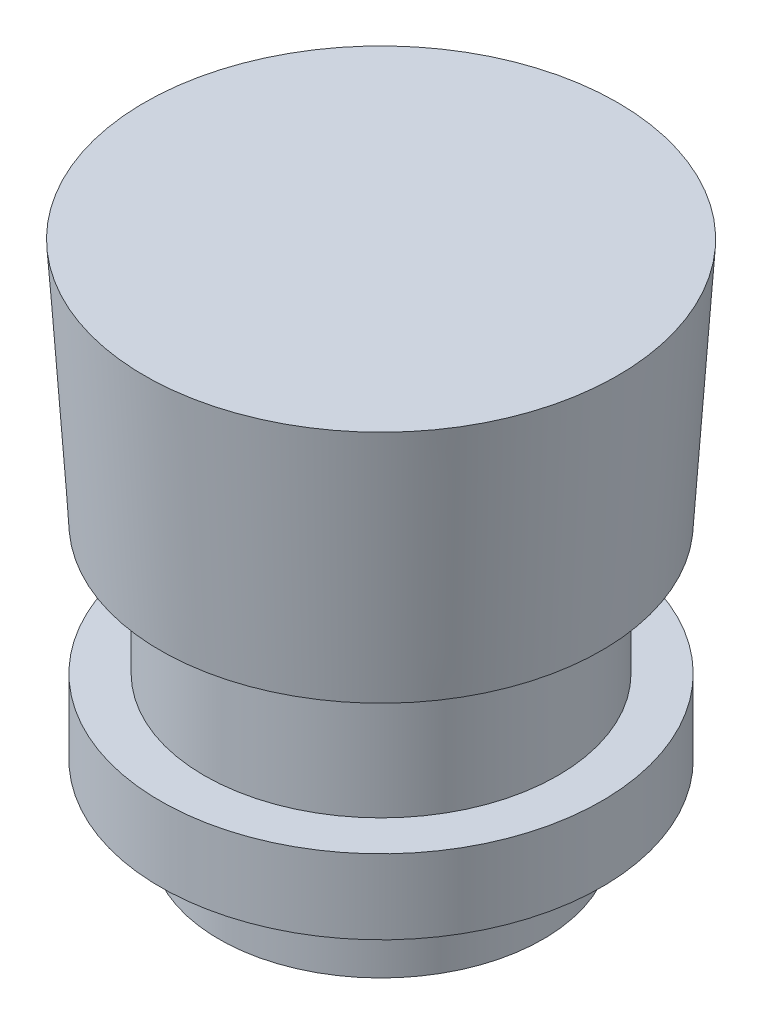
ISO-10303-21;
HEADER;
FILE_DESCRIPTION(('STEP AP214'),'2;1');
FILE_NAME('part.step','',(''),(''),'','','');
FILE_SCHEMA(('AUTOMOTIVE_DESIGN { 1 0 10303 214 1 1 1 1 }'));
ENDSEC;
DATA;
#1=APPLICATION_CONTEXT('core data for automotive mechanical design processes');
#2=APPLICATION_PROTOCOL_DEFINITION('international standard','automotive_design',2000,#1);
#3=PRODUCT_CONTEXT('',#1,'mechanical');
#4=PRODUCT('Part','Part','',(#3));
#5=PRODUCT_RELATED_PRODUCT_CATEGORY('part','',(#4));
#6=PRODUCT_DEFINITION_FORMATION('','',#4);
#7=PRODUCT_DEFINITION_CONTEXT('part definition',#1,'design');
#8=PRODUCT_DEFINITION('design','',#6,#7);
#9=PRODUCT_DEFINITION_SHAPE('','',#8);
#10=(LENGTH_UNIT() NAMED_UNIT(*) SI_UNIT(.MILLI.,.METRE.));
#11=(NAMED_UNIT(*) PLANE_ANGLE_UNIT() SI_UNIT($,.RADIAN.));
#12=(NAMED_UNIT(*) SI_UNIT($,.STERADIAN.) SOLID_ANGLE_UNIT());
#13=UNCERTAINTY_MEASURE_WITH_UNIT(LENGTH_MEASURE(1.E-05),#10,'distance_accuracy_value','');
#14=(GEOMETRIC_REPRESENTATION_CONTEXT(3) GLOBAL_UNCERTAINTY_ASSIGNED_CONTEXT((#13)) GLOBAL_UNIT_ASSIGNED_CONTEXT((#10,
#11,#12)) REPRESENTATION_CONTEXT('',''));
#15=CARTESIAN_POINT('',(0.,0.,0.));
#16=DIRECTION('',(0.,0.,1.));
#17=DIRECTION('',(1.,0.,0.));
#18=AXIS2_PLACEMENT_3D('',#15,#16,#17);
#19=CARTESIAN_POINT('',(0.,17.907,0.));
#20=DIRECTION('',(0.,-1.,0.));
#21=DIRECTION('',(0.,0.,-1.));
#22=AXIS2_PLACEMENT_3D('',#19,#20,#21);
#23=PLANE('',#22);
#24=CARTESIAN_POINT('',(0.,17.907,0.));
#25=DIRECTION('',(0.,-1.,0.));
#26=DIRECTION('',(0.,0.,-1.));
#27=AXIS2_PLACEMENT_3D('',#24,#25,#26);
#28=CIRCLE('',#27,16.129);
#29=CARTESIAN_POINT('',(0.,17.907,-16.129));
#30=VERTEX_POINT('',#29);
#31=EDGE_CURVE('E10',#30,#30,#28,.T.);
#32=ORIENTED_EDGE('',*,*,#31,.F.);
#33=EDGE_LOOP('',(#32));
#34=FACE_BOUND('',#33,.T.);
#35=ADVANCED_FACE('F43',(#34),#23,.F.);
#36=CARTESIAN_POINT('',(0.,17.907,0.));
#37=DIRECTION('',(0.,1.,0.));
#38=DIRECTION('',(0.,0.,1.));
#39=AXIS2_PLACEMENT_3D('',#36,#37,#38);
#40=CONICAL_SURFACE('',#39,16.129,0.0643348579140966);
#41=CARTESIAN_POINT('',(0.,1.14299999999999,0.));
#42=DIRECTION('',(0.,-1.,0.));
#43=DIRECTION('',(0.,0.,-1.));
#44=AXIS2_PLACEMENT_3D('',#41,#42,#43);
#45=CIRCLE('',#44,15.049);
#46=CARTESIAN_POINT('',(0.,1.14299999999999,-15.049));
#47=VERTEX_POINT('',#46);
#48=EDGE_CURVE('E49',#47,#47,#45,.T.);
#49=ORIENTED_EDGE('',*,*,#48,.F.);
#50=EDGE_LOOP('',(#49));
#51=FACE_BOUND('',#50,.T.);
#52=ORIENTED_EDGE('',*,*,#31,.T.);
#53=EDGE_LOOP('',(#52));
#54=FACE_BOUND('',#53,.T.);
#55=ADVANCED_FACE('F109',(#51,#54),#40,.T.);
#56=CARTESIAN_POINT('',(-15.049,1.14299999999999,0.));
#57=DIRECTION('',(0.,1.,0.));
#58=DIRECTION('',(0.,0.,1.));
#59=AXIS2_PLACEMENT_3D('',#56,#57,#58);
#60=PLANE('',#59);
#61=CARTESIAN_POINT('',(0.,1.14299999999999,0.));
#62=DIRECTION('',(0.,-1.,0.));
#63=DIRECTION('',(0.,0.,-1.));
#64=AXIS2_PLACEMENT_3D('',#61,#62,#63);
#65=CIRCLE('',#64,12.049);
#66=CARTESIAN_POINT('',(0.,1.14299999999999,-12.049));
#67=VERTEX_POINT('',#66);
#68=EDGE_CURVE('E53',#67,#67,#65,.T.);
#69=ORIENTED_EDGE('',*,*,#68,.F.);
#70=EDGE_LOOP('',(#69));
#71=FACE_BOUND('',#70,.T.);
#72=ORIENTED_EDGE('',*,*,#48,.T.);
#73=EDGE_LOOP('',(#72));
#74=FACE_BOUND('',#73,.T.);
#75=ADVANCED_FACE('F104',(#71,#74),#60,.F.);
#76=CARTESIAN_POINT('',(0.,0.,0.));
#77=DIRECTION('',(0.,-1.,0.));
#78=DIRECTION('',(0.,0.,-1.));
#79=AXIS2_PLACEMENT_3D('',#76,#77,#78);
#80=CYLINDRICAL_SURFACE('',#79,12.049);
#81=CARTESIAN_POINT('',(0.,-7.74700000000001,0.));
#82=DIRECTION('',(0.,-1.,0.));
#83=DIRECTION('',(0.,0.,-1.));
#84=AXIS2_PLACEMENT_3D('',#81,#82,#83);
#85=CIRCLE('',#84,12.049);
#86=CARTESIAN_POINT('',(0.,-7.74700000000001,-12.049));
#87=VERTEX_POINT('',#86);
#88=EDGE_CURVE('E57',#87,#87,#85,.T.);
#89=ORIENTED_EDGE('',*,*,#88,.F.);
#90=EDGE_LOOP('',(#89));
#91=FACE_BOUND('',#90,.T.);
#92=ORIENTED_EDGE('',*,*,#68,.T.);
#93=EDGE_LOOP('',(#92));
#94=FACE_BOUND('',#93,.T.);
#95=ADVANCED_FACE('F98',(#91,#94),#80,.T.);
#96=CARTESIAN_POINT('',(-12.049,-7.74700000000001,0.));
#97=DIRECTION('',(0.,-1.,0.));
#98=DIRECTION('',(0.,0.,-1.));
#99=AXIS2_PLACEMENT_3D('',#96,#97,#98);
#100=PLANE('',#99);
#101=CARTESIAN_POINT('',(0.,-7.74700000000001,0.));
#102=DIRECTION('',(0.,-1.,0.));
#103=DIRECTION('',(0.,0.,-1.));
#104=AXIS2_PLACEMENT_3D('',#101,#102,#103);
#105=CIRCLE('',#104,15.049);
#106=CARTESIAN_POINT('',(0.,-7.74700000000001,-15.049));
#107=VERTEX_POINT('',#106);
#108=EDGE_CURVE('E62',#107,#107,#105,.T.);
#109=ORIENTED_EDGE('',*,*,#108,.F.);
#110=EDGE_LOOP('',(#109));
#111=FACE_BOUND('',#110,.T.);
#112=ORIENTED_EDGE('',*,*,#88,.T.);
#113=EDGE_LOOP('',(#112));
#114=FACE_BOUND('',#113,.T.);
#115=ADVANCED_FACE('F92',(#111,#114),#100,.F.);
#116=CARTESIAN_POINT('',(0.,0.,0.));
#117=DIRECTION('',(0.,-1.,0.));
#118=DIRECTION('',(0.,0.,-1.));
#119=AXIS2_PLACEMENT_3D('',#116,#117,#118);
#120=CYLINDRICAL_SURFACE('',#119,15.049);
#121=CARTESIAN_POINT('',(0.,-12.827,0.));
#122=DIRECTION('',(0.,-1.,0.));
#123=DIRECTION('',(0.,0.,-1.));
#124=AXIS2_PLACEMENT_3D('',#121,#122,#123);
#125=CIRCLE('',#124,15.049);
#126=CARTESIAN_POINT('',(0.,-12.827,-15.049));
#127=VERTEX_POINT('',#126);
#128=EDGE_CURVE('E65',#127,#127,#125,.T.);
#129=ORIENTED_EDGE('',*,*,#128,.F.);
#130=EDGE_LOOP('',(#129));
#131=FACE_BOUND('',#130,.T.);
#132=ORIENTED_EDGE('',*,*,#108,.T.);
#133=EDGE_LOOP('',(#132));
#134=FACE_BOUND('',#133,.T.);
#135=ADVANCED_FACE('F86',(#131,#134),#120,.T.);
#136=CARTESIAN_POINT('',(-15.049,-12.827,0.));
#137=DIRECTION('',(0.,1.,0.));
#138=DIRECTION('',(0.,0.,1.));
#139=AXIS2_PLACEMENT_3D('',#136,#137,#138);
#140=PLANE('',#139);
#141=CARTESIAN_POINT('',(0.,-12.827,0.));
#142=DIRECTION('',(0.,-1.,0.));
#143=DIRECTION('',(0.,0.,-1.));
#144=AXIS2_PLACEMENT_3D('',#141,#142,#143);
#145=CIRCLE('',#144,11.049);
#146=CARTESIAN_POINT('',(0.,-12.827,-11.049));
#147=VERTEX_POINT('',#146);
#148=EDGE_CURVE('E68',#147,#147,#145,.T.);
#149=ORIENTED_EDGE('',*,*,#148,.F.);
#150=EDGE_LOOP('',(#149));
#151=FACE_BOUND('',#150,.T.);
#152=ORIENTED_EDGE('',*,*,#128,.T.);
#153=EDGE_LOOP('',(#152));
#154=FACE_BOUND('',#153,.T.);
#155=ADVANCED_FACE('F80',(#151,#154),#140,.F.);
#156=CARTESIAN_POINT('',(0.,0.,0.));
#157=DIRECTION('',(0.,-1.,0.));
#158=DIRECTION('',(0.,0.,-1.));
#159=AXIS2_PLACEMENT_3D('',#156,#157,#158);
#160=CYLINDRICAL_SURFACE('',#159,11.049);
#161=CARTESIAN_POINT('',(0.,-17.907,0.));
#162=DIRECTION('',(0.,-1.,0.));
#163=DIRECTION('',(0.,0.,-1.));
#164=AXIS2_PLACEMENT_3D('',#161,#162,#163);
#165=CIRCLE('',#164,11.049);
#166=CARTESIAN_POINT('',(0.,-17.907,-11.049));
#167=VERTEX_POINT('',#166);
#168=EDGE_CURVE('E71',#167,#167,#165,.T.);
#169=ORIENTED_EDGE('',*,*,#168,.F.);
#170=EDGE_LOOP('',(#169));
#171=FACE_BOUND('',#170,.T.);
#172=ORIENTED_EDGE('',*,*,#148,.T.);
#173=EDGE_LOOP('',(#172));
#174=FACE_BOUND('',#173,.T.);
#175=ADVANCED_FACE('F77',(#171,#174),#160,.T.);
#176=CARTESIAN_POINT('',(-11.049,-17.907,0.));
#177=DIRECTION('',(0.,1.,0.));
#178=DIRECTION('',(0.,0.,1.));
#179=AXIS2_PLACEMENT_3D('',#176,#177,#178);
#180=PLANE('',#179);
#181=ORIENTED_EDGE('',*,*,#168,.T.);
#182=EDGE_LOOP('',(#181));
#183=FACE_BOUND('',#182,.T.);
#184=ADVANCED_FACE('F75',(#183),#180,.F.);
#185=CLOSED_SHELL('',(#35,#55,#75,#95,#115,#135,#155,#175,#184));
#186=MANIFOLD_SOLID_BREP('B2',#185);
#187=ADVANCED_BREP_SHAPE_REPRESENTATION('',(#18,#186),#14);
#188=SHAPE_DEFINITION_REPRESENTATION(#9,#187);
ENDSEC;
END-ISO-10303-21;
